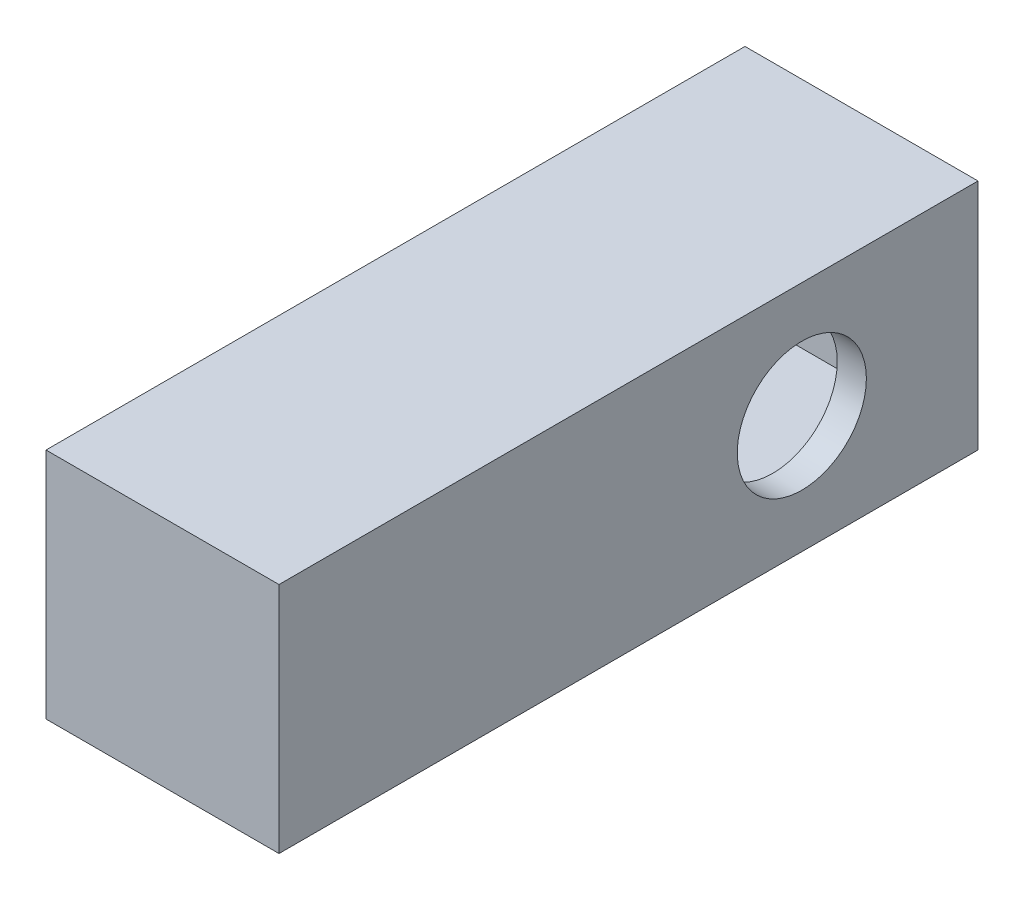
ISO-10303-21;
HEADER;
FILE_DESCRIPTION(('STEP AP214'),'2;1');
FILE_NAME('part.step','',(''),(''),'','','');
FILE_SCHEMA(('AUTOMOTIVE_DESIGN { 1 0 10303 214 1 1 1 1 }'));
ENDSEC;
DATA;
#1=APPLICATION_CONTEXT('core data for automotive mechanical design processes');
#2=APPLICATION_PROTOCOL_DEFINITION('international standard','automotive_design',2000,#1);
#3=PRODUCT_CONTEXT('',#1,'mechanical');
#4=PRODUCT('Part','Part','',(#3));
#5=PRODUCT_RELATED_PRODUCT_CATEGORY('part','',(#4));
#6=PRODUCT_DEFINITION_FORMATION('','',#4);
#7=PRODUCT_DEFINITION_CONTEXT('part definition',#1,'design');
#8=PRODUCT_DEFINITION('design','',#6,#7);
#9=PRODUCT_DEFINITION_SHAPE('','',#8);
#10=(LENGTH_UNIT() NAMED_UNIT(*) SI_UNIT(.MILLI.,.METRE.));
#11=(NAMED_UNIT(*) PLANE_ANGLE_UNIT() SI_UNIT($,.RADIAN.));
#12=(NAMED_UNIT(*) SI_UNIT($,.STERADIAN.) SOLID_ANGLE_UNIT());
#13=UNCERTAINTY_MEASURE_WITH_UNIT(LENGTH_MEASURE(1.E-05),#10,'distance_accuracy_value','');
#14=(GEOMETRIC_REPRESENTATION_CONTEXT(3) GLOBAL_UNCERTAINTY_ASSIGNED_CONTEXT((#13)) GLOBAL_UNIT_ASSIGNED_CONTEXT((#10,
#11,#12)) REPRESENTATION_CONTEXT('',''));
#15=CARTESIAN_POINT('',(0.,0.,0.));
#16=DIRECTION('',(0.,0.,1.));
#17=DIRECTION('',(1.,0.,0.));
#18=AXIS2_PLACEMENT_3D('',#15,#16,#17);
#19=CARTESIAN_POINT('',(0.,50.8,0.));
#20=DIRECTION('',(1.,0.,0.));
#21=DIRECTION('',(0.,0.,-1.));
#22=AXIS2_PLACEMENT_3D('',#19,#20,#21);
#23=PLANE('',#22);
#24=DIRECTION('',(0.,0.,1.));
#25=VECTOR('',#24,1.);
#26=CARTESIAN_POINT('',(0.,0.,0.));
#27=LINE('',#26,#25);
#28=CARTESIAN_POINT('',(0.,0.,-152.4));
#29=VERTEX_POINT('',#28);
#30=CARTESIAN_POINT('',(0.,0.,0.));
#31=VERTEX_POINT('',#30);
#32=EDGE_CURVE('E149',#29,#31,#27,.T.);
#33=ORIENTED_EDGE('',*,*,#32,.T.);
#34=DIRECTION('',(0.,-1.,0.));
#35=VECTOR('',#34,1.);
#36=CARTESIAN_POINT('',(0.,50.8,0.));
#37=LINE('',#36,#35);
#38=CARTESIAN_POINT('',(0.,50.8,0.));
#39=VERTEX_POINT('',#38);
#40=EDGE_CURVE('E11',#39,#31,#37,.T.);
#41=ORIENTED_EDGE('',*,*,#40,.F.);
#42=DIRECTION('',(0.,0.,1.));
#43=VECTOR('',#42,1.);
#44=CARTESIAN_POINT('',(0.,50.8,0.));
#45=LINE('',#44,#43);
#46=CARTESIAN_POINT('',(0.,50.8,-152.4));
#47=VERTEX_POINT('',#46);
#48=EDGE_CURVE('E154',#47,#39,#45,.T.);
#49=ORIENTED_EDGE('',*,*,#48,.F.);
#50=DIRECTION('',(0.,-1.,0.));
#51=VECTOR('',#50,1.);
#52=CARTESIAN_POINT('',(0.,50.8,-152.4));
#53=LINE('',#52,#51);
#54=EDGE_CURVE('E160',#47,#29,#53,.T.);
#55=ORIENTED_EDGE('',*,*,#54,.T.);
#56=EDGE_LOOP('',(#33,#41,#49,#55));
#57=FACE_BOUND('',#56,.T.);
#58=DIRECTION('',(0.,0.,1.));
#59=VECTOR('',#58,1.);
#60=CARTESIAN_POINT('',(0.,6.35,0.));
#61=LINE('',#60,#59);
#62=CARTESIAN_POINT('',(0.,6.35,-146.05));
#63=VERTEX_POINT('',#62);
#64=CARTESIAN_POINT('',(0.,6.35,-6.35));
#65=VERTEX_POINT('',#64);
#66=EDGE_CURVE('E120',#63,#65,#61,.T.);
#67=ORIENTED_EDGE('',*,*,#66,.F.);
#68=DIRECTION('',(0.,-1.,0.));
#69=VECTOR('',#68,1.);
#70=CARTESIAN_POINT('',(0.,50.8,-146.05));
#71=LINE('',#70,#69);
#72=CARTESIAN_POINT('',(0.,44.45,-146.05));
#73=VERTEX_POINT('',#72);
#74=EDGE_CURVE('E143',#73,#63,#71,.T.);
#75=ORIENTED_EDGE('',*,*,#74,.F.);
#76=DIRECTION('',(0.,0.,1.));
#77=VECTOR('',#76,1.);
#78=CARTESIAN_POINT('',(0.,44.45,0.));
#79=LINE('',#78,#77);
#80=CARTESIAN_POINT('',(0.,44.45,-6.35));
#81=VERTEX_POINT('',#80);
#82=EDGE_CURVE('E54',#73,#81,#79,.T.);
#83=ORIENTED_EDGE('',*,*,#82,.T.);
#84=DIRECTION('',(0.,-1.,0.));
#85=VECTOR('',#84,1.);
#86=CARTESIAN_POINT('',(0.,50.8,-6.35));
#87=LINE('',#86,#85);
#88=EDGE_CURVE('E131',#81,#65,#87,.T.);
#89=ORIENTED_EDGE('',*,*,#88,.T.);
#90=EDGE_LOOP('',(#67,#75,#83,#89));
#91=FACE_BOUND('',#90,.T.);
#92=ADVANCED_FACE('F39',(#57,#91),#23,.F.);
#93=CARTESIAN_POINT('',(0.,50.8,0.));
#94=DIRECTION('',(0.,0.,-1.));
#95=DIRECTION('',(-1.,0.,0.));
#96=AXIS2_PLACEMENT_3D('',#93,#94,#95);
#97=PLANE('',#96);
#98=DIRECTION('',(1.,0.,0.));
#99=VECTOR('',#98,1.);
#100=CARTESIAN_POINT('',(0.,0.,0.));
#101=LINE('',#100,#99);
#102=CARTESIAN_POINT('',(50.8,0.,0.));
#103=VERTEX_POINT('',#102);
#104=EDGE_CURVE('E163',#31,#103,#101,.T.);
#105=ORIENTED_EDGE('',*,*,#104,.T.);
#106=DIRECTION('',(0.,-1.,0.));
#107=VECTOR('',#106,1.);
#108=CARTESIAN_POINT('',(50.8,50.8,0.));
#109=LINE('',#108,#107);
#110=CARTESIAN_POINT('',(50.8,50.8,0.));
#111=VERTEX_POINT('',#110);
#112=EDGE_CURVE('E47',#111,#103,#109,.T.);
#113=ORIENTED_EDGE('',*,*,#112,.F.);
#114=DIRECTION('',(1.,0.,0.));
#115=VECTOR('',#114,1.);
#116=CARTESIAN_POINT('',(0.,50.8,0.));
#117=LINE('',#116,#115);
#118=EDGE_CURVE('E91',#39,#111,#117,.T.);
#119=ORIENTED_EDGE('',*,*,#118,.F.);
#120=ORIENTED_EDGE('',*,*,#40,.T.);
#121=EDGE_LOOP('',(#105,#113,#119,#120));
#122=FACE_BOUND('',#121,.T.);
#123=ADVANCED_FACE('F193',(#122),#97,.F.);
#124=CARTESIAN_POINT('',(50.8,50.8,0.));
#125=DIRECTION('',(-1.,0.,0.));
#126=DIRECTION('',(0.,0.,1.));
#127=AXIS2_PLACEMENT_3D('',#124,#125,#126);
#128=PLANE('',#127);
#129=CARTESIAN_POINT('',(50.8,25.6834551892925,-113.988045790727));
#130=DIRECTION('',(1.,0.,0.));
#131=DIRECTION('',(0.,0.,-1.));
#132=AXIS2_PLACEMENT_3D('',#129,#130,#131);
#133=CIRCLE('',#132,14.075);
#134=CARTESIAN_POINT('',(50.8,25.6834551892925,-128.063045790727));
#135=VERTEX_POINT('',#134);
#136=EDGE_CURVE('E318',#135,#135,#133,.T.);
#137=ORIENTED_EDGE('',*,*,#136,.F.);
#138=EDGE_LOOP('',(#137));
#139=FACE_BOUND('',#138,.T.);
#140=DIRECTION('',(0.,0.,-1.));
#141=VECTOR('',#140,1.);
#142=CARTESIAN_POINT('',(50.8,0.,0.));
#143=LINE('',#142,#141);
#144=CARTESIAN_POINT('',(50.8,0.,-152.4));
#145=VERTEX_POINT('',#144);
#146=EDGE_CURVE('E165',#103,#145,#143,.T.);
#147=ORIENTED_EDGE('',*,*,#146,.T.);
#148=DIRECTION('',(0.,-1.,0.));
#149=VECTOR('',#148,1.);
#150=CARTESIAN_POINT('',(50.8,50.8,-152.4));
#151=LINE('',#150,#149);
#152=CARTESIAN_POINT('',(50.8,50.8,-152.4));
#153=VERTEX_POINT('',#152);
#154=EDGE_CURVE('E169',#153,#145,#151,.T.);
#155=ORIENTED_EDGE('',*,*,#154,.F.);
#156=DIRECTION('',(0.,0.,-1.));
#157=VECTOR('',#156,1.);
#158=CARTESIAN_POINT('',(50.8,50.8,0.));
#159=LINE('',#158,#157);
#160=EDGE_CURVE('E157',#111,#153,#159,.T.);
#161=ORIENTED_EDGE('',*,*,#160,.F.);
#162=ORIENTED_EDGE('',*,*,#112,.T.);
#163=EDGE_LOOP('',(#147,#155,#161,#162));
#164=FACE_BOUND('',#163,.T.);
#165=ADVANCED_FACE('F175',(#139,#164),#128,.F.);
#166=CARTESIAN_POINT('',(0.,50.8,-152.4));
#167=DIRECTION('',(0.,0.,1.));
#168=DIRECTION('',(1.,0.,0.));
#169=AXIS2_PLACEMENT_3D('',#166,#167,#168);
#170=PLANE('',#169);
#171=DIRECTION('',(-1.,0.,0.));
#172=VECTOR('',#171,1.);
#173=CARTESIAN_POINT('',(0.,0.,-152.4));
#174=LINE('',#173,#172);
#175=EDGE_CURVE('E84',#145,#29,#174,.T.);
#176=ORIENTED_EDGE('',*,*,#175,.T.);
#177=ORIENTED_EDGE('',*,*,#54,.F.);
#178=DIRECTION('',(-1.,0.,0.));
#179=VECTOR('',#178,1.);
#180=CARTESIAN_POINT('',(0.,50.8,-152.4));
#181=LINE('',#180,#179);
#182=EDGE_CURVE('E63',#153,#47,#181,.T.);
#183=ORIENTED_EDGE('',*,*,#182,.F.);
#184=ORIENTED_EDGE('',*,*,#154,.T.);
#185=EDGE_LOOP('',(#176,#177,#183,#184));
#186=FACE_BOUND('',#185,.T.);
#187=ADVANCED_FACE('F184',(#186),#170,.F.);
#188=CARTESIAN_POINT('',(0.,50.8,0.));
#189=DIRECTION('',(0.,-1.,0.));
#190=DIRECTION('',(0.,0.,-1.));
#191=AXIS2_PLACEMENT_3D('',#188,#189,#190);
#192=PLANE('',#191);
#193=ORIENTED_EDGE('',*,*,#48,.T.);
#194=ORIENTED_EDGE('',*,*,#118,.T.);
#195=ORIENTED_EDGE('',*,*,#160,.T.);
#196=ORIENTED_EDGE('',*,*,#182,.T.);
#197=EDGE_LOOP('',(#193,#194,#195,#196));
#198=FACE_BOUND('',#197,.T.);
#199=ADVANCED_FACE('F186',(#198),#192,.F.);
#200=CARTESIAN_POINT('',(0.,0.,0.));
#201=DIRECTION('',(0.,-1.,0.));
#202=DIRECTION('',(0.,0.,-1.));
#203=AXIS2_PLACEMENT_3D('',#200,#201,#202);
#204=PLANE('',#203);
#205=ORIENTED_EDGE('',*,*,#32,.F.);
#206=ORIENTED_EDGE('',*,*,#175,.F.);
#207=ORIENTED_EDGE('',*,*,#146,.F.);
#208=ORIENTED_EDGE('',*,*,#104,.F.);
#209=EDGE_LOOP('',(#205,#206,#207,#208));
#210=FACE_BOUND('',#209,.T.);
#211=ADVANCED_FACE('F179',(#210),#204,.T.);
#212=CARTESIAN_POINT('',(0.,50.8,-6.35));
#213=DIRECTION('',(0.,0.,-1.));
#214=DIRECTION('',(-1.,0.,0.));
#215=AXIS2_PLACEMENT_3D('',#212,#213,#214);
#216=PLANE('',#215);
#217=DIRECTION('',(1.,0.,0.));
#218=VECTOR('',#217,1.);
#219=CARTESIAN_POINT('',(0.,6.35,-6.35));
#220=LINE('',#219,#218);
#221=CARTESIAN_POINT('',(44.45,6.35,-6.35));
#222=VERTEX_POINT('',#221);
#223=EDGE_CURVE('E113',#65,#222,#220,.T.);
#224=ORIENTED_EDGE('',*,*,#223,.F.);
#225=ORIENTED_EDGE('',*,*,#88,.F.);
#226=DIRECTION('',(1.,0.,0.));
#227=VECTOR('',#226,1.);
#228=CARTESIAN_POINT('',(0.,44.45,-6.35));
#229=LINE('',#228,#227);
#230=CARTESIAN_POINT('',(44.45,44.45,-6.35));
#231=VERTEX_POINT('',#230);
#232=EDGE_CURVE('E128',#81,#231,#229,.T.);
#233=ORIENTED_EDGE('',*,*,#232,.T.);
#234=DIRECTION('',(0.,-1.,0.));
#235=VECTOR('',#234,1.);
#236=CARTESIAN_POINT('',(44.45,50.8,-6.35));
#237=LINE('',#236,#235);
#238=EDGE_CURVE('E126',#231,#222,#237,.T.);
#239=ORIENTED_EDGE('',*,*,#238,.T.);
#240=EDGE_LOOP('',(#224,#225,#233,#239));
#241=FACE_BOUND('',#240,.T.);
#242=ADVANCED_FACE('F127',(#241),#216,.T.);
#243=CARTESIAN_POINT('',(44.45,50.8,0.));
#244=DIRECTION('',(-1.,0.,0.));
#245=DIRECTION('',(0.,0.,1.));
#246=AXIS2_PLACEMENT_3D('',#243,#244,#245);
#247=PLANE('',#246);
#248=CARTESIAN_POINT('',(44.45,25.6834551892925,-113.988045790727));
#249=DIRECTION('',(-1.,0.,0.));
#250=DIRECTION('',(0.,0.,1.));
#251=AXIS2_PLACEMENT_3D('',#248,#249,#250);
#252=CIRCLE('',#251,14.075);
#253=CARTESIAN_POINT('',(44.45,25.6834551892925,-99.9130457907273));
#254=VERTEX_POINT('',#253);
#255=EDGE_CURVE('E42',#254,#254,#252,.T.);
#256=ORIENTED_EDGE('',*,*,#255,.F.);
#257=EDGE_LOOP('',(#256));
#258=FACE_BOUND('',#257,.T.);
#259=DIRECTION('',(0.,0.,-1.));
#260=VECTOR('',#259,1.);
#261=CARTESIAN_POINT('',(44.45,6.35,0.));
#262=LINE('',#261,#260);
#263=CARTESIAN_POINT('',(44.45,6.35,-146.05));
#264=VERTEX_POINT('',#263);
#265=EDGE_CURVE('E117',#222,#264,#262,.T.);
#266=ORIENTED_EDGE('',*,*,#265,.F.);
#267=ORIENTED_EDGE('',*,*,#238,.F.);
#268=DIRECTION('',(0.,0.,-1.));
#269=VECTOR('',#268,1.);
#270=CARTESIAN_POINT('',(44.45,44.45,0.));
#271=LINE('',#270,#269);
#272=CARTESIAN_POINT('',(44.45,44.45,-146.05));
#273=VERTEX_POINT('',#272);
#274=EDGE_CURVE('E144',#231,#273,#271,.T.);
#275=ORIENTED_EDGE('',*,*,#274,.T.);
#276=DIRECTION('',(0.,-1.,0.));
#277=VECTOR('',#276,1.);
#278=CARTESIAN_POINT('',(44.45,50.8,-146.05));
#279=LINE('',#278,#277);
#280=EDGE_CURVE('E132',#273,#264,#279,.T.);
#281=ORIENTED_EDGE('',*,*,#280,.T.);
#282=EDGE_LOOP('',(#266,#267,#275,#281));
#283=FACE_BOUND('',#282,.T.);
#284=ADVANCED_FACE('F134',(#258,#283),#247,.T.);
#285=CARTESIAN_POINT('',(0.,50.8,-146.05));
#286=DIRECTION('',(0.,0.,1.));
#287=DIRECTION('',(1.,0.,0.));
#288=AXIS2_PLACEMENT_3D('',#285,#286,#287);
#289=PLANE('',#288);
#290=DIRECTION('',(-1.,0.,0.));
#291=VECTOR('',#290,1.);
#292=CARTESIAN_POINT('',(0.,6.35,-146.05));
#293=LINE('',#292,#291);
#294=EDGE_CURVE('E137',#264,#63,#293,.T.);
#295=ORIENTED_EDGE('',*,*,#294,.F.);
#296=ORIENTED_EDGE('',*,*,#280,.F.);
#297=DIRECTION('',(-1.,0.,0.));
#298=VECTOR('',#297,1.);
#299=CARTESIAN_POINT('',(0.,44.45,-146.05));
#300=LINE('',#299,#298);
#301=EDGE_CURVE('E145',#273,#73,#300,.T.);
#302=ORIENTED_EDGE('',*,*,#301,.T.);
#303=ORIENTED_EDGE('',*,*,#74,.T.);
#304=EDGE_LOOP('',(#295,#296,#302,#303));
#305=FACE_BOUND('',#304,.T.);
#306=ADVANCED_FACE('F223',(#305),#289,.T.);
#307=CARTESIAN_POINT('',(0.,44.45,0.));
#308=DIRECTION('',(0.,-1.,0.));
#309=DIRECTION('',(0.,0.,-1.));
#310=AXIS2_PLACEMENT_3D('',#307,#308,#309);
#311=PLANE('',#310);
#312=ORIENTED_EDGE('',*,*,#82,.F.);
#313=ORIENTED_EDGE('',*,*,#301,.F.);
#314=ORIENTED_EDGE('',*,*,#274,.F.);
#315=ORIENTED_EDGE('',*,*,#232,.F.);
#316=EDGE_LOOP('',(#312,#313,#314,#315));
#317=FACE_BOUND('',#316,.T.);
#318=ADVANCED_FACE('F246',(#317),#311,.T.);
#319=CARTESIAN_POINT('',(0.,6.35,0.));
#320=DIRECTION('',(0.,-1.,0.));
#321=DIRECTION('',(0.,0.,-1.));
#322=AXIS2_PLACEMENT_3D('',#319,#320,#321);
#323=PLANE('',#322);
#324=ORIENTED_EDGE('',*,*,#66,.T.);
#325=ORIENTED_EDGE('',*,*,#223,.T.);
#326=ORIENTED_EDGE('',*,*,#265,.T.);
#327=ORIENTED_EDGE('',*,*,#294,.T.);
#328=EDGE_LOOP('',(#324,#325,#326,#327));
#329=FACE_BOUND('',#328,.T.);
#330=ADVANCED_FACE('F115',(#329),#323,.F.);
#331=CARTESIAN_POINT('',(25.8,25.6834551892925,-113.988045790727));
#332=DIRECTION('',(1.,0.,0.));
#333=DIRECTION('',(0.,0.,-1.));
#334=AXIS2_PLACEMENT_3D('',#331,#332,#333);
#335=CYLINDRICAL_SURFACE('',#334,14.075);
#336=ORIENTED_EDGE('',*,*,#255,.T.);
#337=EDGE_LOOP('',(#336));
#338=FACE_BOUND('',#337,.T.);
#339=ORIENTED_EDGE('',*,*,#136,.T.);
#340=EDGE_LOOP('',(#339));
#341=FACE_BOUND('',#340,.T.);
#342=ADVANCED_FACE('F234',(#338,#341),#335,.F.);
#343=CLOSED_SHELL('',(#92,#123,#165,#187,#199,#211,#242,#284,#306,#318,#330,#342));
#344=MANIFOLD_SOLID_BREP('B2',#343);
#345=ADVANCED_BREP_SHAPE_REPRESENTATION('',(#18,#344),#14);
#346=SHAPE_DEFINITION_REPRESENTATION(#9,#345);
ENDSEC;
END-ISO-10303-21;
